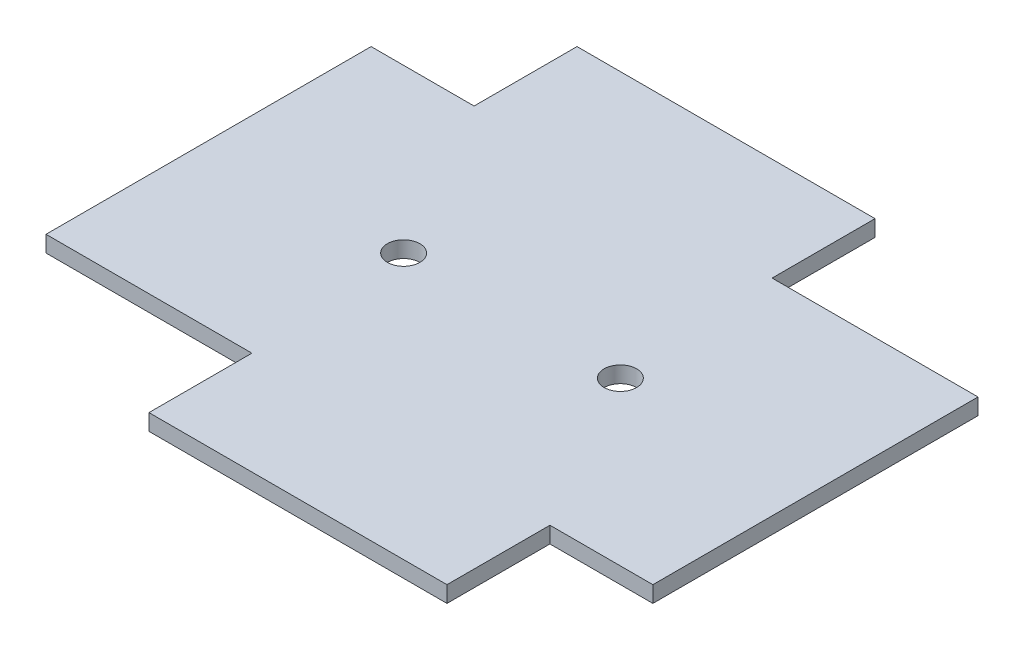
ISO-10303-21;
HEADER;
FILE_DESCRIPTION(('STEP AP214'),'2;1');
FILE_NAME('part.step','',(''),(''),'','','');
FILE_SCHEMA(('AUTOMOTIVE_DESIGN { 1 0 10303 214 1 1 1 1 }'));
ENDSEC;
DATA;
#1=APPLICATION_CONTEXT('core data for automotive mechanical design processes');
#2=APPLICATION_PROTOCOL_DEFINITION('international standard','automotive_design',2000,#1);
#3=PRODUCT_CONTEXT('',#1,'mechanical');
#4=PRODUCT('Part','Part','',(#3));
#5=PRODUCT_RELATED_PRODUCT_CATEGORY('part','',(#4));
#6=PRODUCT_DEFINITION_FORMATION('','',#4);
#7=PRODUCT_DEFINITION_CONTEXT('part definition',#1,'design');
#8=PRODUCT_DEFINITION('design','',#6,#7);
#9=PRODUCT_DEFINITION_SHAPE('','',#8);
#10=(LENGTH_UNIT() NAMED_UNIT(*) SI_UNIT(.MILLI.,.METRE.));
#11=(NAMED_UNIT(*) PLANE_ANGLE_UNIT() SI_UNIT($,.RADIAN.));
#12=(NAMED_UNIT(*) SI_UNIT($,.STERADIAN.) SOLID_ANGLE_UNIT());
#13=UNCERTAINTY_MEASURE_WITH_UNIT(LENGTH_MEASURE(1.E-05),#10,'distance_accuracy_value','');
#14=(GEOMETRIC_REPRESENTATION_CONTEXT(3) GLOBAL_UNCERTAINTY_ASSIGNED_CONTEXT((#13)) GLOBAL_UNIT_ASSIGNED_CONTEXT((#10,
#11,#12)) REPRESENTATION_CONTEXT('',''));
#15=CARTESIAN_POINT('',(0.,0.,0.));
#16=DIRECTION('',(0.,0.,1.));
#17=DIRECTION('',(1.,0.,0.));
#18=AXIS2_PLACEMENT_3D('',#15,#16,#17);
#19=CARTESIAN_POINT('',(0.,1.5,0.));
#20=DIRECTION('',(0.,1.,0.));
#21=DIRECTION('',(0.,0.,1.));
#22=AXIS2_PLACEMENT_3D('',#19,#20,#21);
#23=PLANE('',#22);
#24=CARTESIAN_POINT('',(-10.,1.5,0.));
#25=DIRECTION('',(0.,1.,0.));
#26=DIRECTION('',(0.,0.,1.));
#27=AXIS2_PLACEMENT_3D('',#24,#25,#26);
#28=CIRCLE('',#27,1.5);
#29=CARTESIAN_POINT('',(-10.,1.5,1.5));
#30=VERTEX_POINT('',#29);
#31=EDGE_CURVE('E158',#30,#30,#28,.T.);
#32=ORIENTED_EDGE('',*,*,#31,.F.);
#33=EDGE_LOOP('',(#32));
#34=FACE_BOUND('',#33,.T.);
#35=DIRECTION('',(-1.,0.,0.));
#36=VECTOR('',#35,1.);
#37=CARTESIAN_POINT('',(-18.5,1.5,-15.));
#38=LINE('',#37,#36);
#39=CARTESIAN_POINT('',(-18.5,1.5,-15.));
#40=VERTEX_POINT('',#39);
#41=CARTESIAN_POINT('',(-28.,1.5,-15.));
#42=VERTEX_POINT('',#41);
#43=EDGE_CURVE('E177',#40,#42,#38,.T.);
#44=ORIENTED_EDGE('',*,*,#43,.T.);
#45=DIRECTION('',(0.,0.,1.));
#46=VECTOR('',#45,1.);
#47=CARTESIAN_POINT('',(-28.,1.5,-15.));
#48=LINE('',#47,#46);
#49=CARTESIAN_POINT('',(-28.,1.5,15.));
#50=VERTEX_POINT('',#49);
#51=EDGE_CURVE('E105',#42,#50,#48,.T.);
#52=ORIENTED_EDGE('',*,*,#51,.T.);
#53=DIRECTION('',(1.,0.,0.));
#54=VECTOR('',#53,1.);
#55=CARTESIAN_POINT('',(-28.,1.5,15.));
#56=LINE('',#55,#54);
#57=CARTESIAN_POINT('',(-9.00000000000001,1.5,15.));
#58=VERTEX_POINT('',#57);
#59=EDGE_CURVE('E204',#50,#58,#56,.T.);
#60=ORIENTED_EDGE('',*,*,#59,.T.);
#61=DIRECTION('',(0.,0.,1.));
#62=VECTOR('',#61,1.);
#63=CARTESIAN_POINT('',(-9.00000000000001,1.5,15.));
#64=LINE('',#63,#62);
#65=CARTESIAN_POINT('',(-8.99999999999999,1.5,24.5));
#66=VERTEX_POINT('',#65);
#67=EDGE_CURVE('E223',#58,#66,#64,.T.);
#68=ORIENTED_EDGE('',*,*,#67,.T.);
#69=DIRECTION('',(1.,0.,0.));
#70=VECTOR('',#69,1.);
#71=CARTESIAN_POINT('',(-8.99999999999999,1.5,24.5));
#72=LINE('',#71,#70);
#73=CARTESIAN_POINT('',(18.5,1.5,24.5));
#74=VERTEX_POINT('',#73);
#75=EDGE_CURVE('E220',#66,#74,#72,.T.);
#76=ORIENTED_EDGE('',*,*,#75,.T.);
#77=DIRECTION('',(0.,0.,-1.));
#78=VECTOR('',#77,1.);
#79=CARTESIAN_POINT('',(18.5,1.5,24.5));
#80=LINE('',#79,#78);
#81=CARTESIAN_POINT('',(18.5,1.5,15.));
#82=VERTEX_POINT('',#81);
#83=EDGE_CURVE('E222',#74,#82,#80,.T.);
#84=ORIENTED_EDGE('',*,*,#83,.T.);
#85=DIRECTION('',(1.,0.,0.));
#86=VECTOR('',#85,1.);
#87=CARTESIAN_POINT('',(18.5,1.5,15.));
#88=LINE('',#87,#86);
#89=CARTESIAN_POINT('',(28.,1.5,15.));
#90=VERTEX_POINT('',#89);
#91=EDGE_CURVE('E225',#82,#90,#88,.T.);
#92=ORIENTED_EDGE('',*,*,#91,.T.);
#93=DIRECTION('',(0.,0.,-1.));
#94=VECTOR('',#93,1.);
#95=CARTESIAN_POINT('',(28.,1.5,15.));
#96=LINE('',#95,#94);
#97=CARTESIAN_POINT('',(28.,1.5,-15.));
#98=VERTEX_POINT('',#97);
#99=EDGE_CURVE('E231',#90,#98,#96,.T.);
#100=ORIENTED_EDGE('',*,*,#99,.T.);
#101=DIRECTION('',(-1.,0.,0.));
#102=VECTOR('',#101,1.);
#103=CARTESIAN_POINT('',(28.,1.5,-15.));
#104=LINE('',#103,#102);
#105=CARTESIAN_POINT('',(9.,1.5,-15.));
#106=VERTEX_POINT('',#105);
#107=EDGE_CURVE('E136',#98,#106,#104,.T.);
#108=ORIENTED_EDGE('',*,*,#107,.T.);
#109=DIRECTION('',(0.,0.,-1.));
#110=VECTOR('',#109,1.);
#111=CARTESIAN_POINT('',(9.,1.5,-15.));
#112=LINE('',#111,#110);
#113=CARTESIAN_POINT('',(8.99999999999999,1.5,-24.5));
#114=VERTEX_POINT('',#113);
#115=EDGE_CURVE('E130',#106,#114,#112,.T.);
#116=ORIENTED_EDGE('',*,*,#115,.T.);
#117=DIRECTION('',(-1.,0.,0.));
#118=VECTOR('',#117,1.);
#119=CARTESIAN_POINT('',(8.99999999999999,1.5,-24.5));
#120=LINE('',#119,#118);
#121=CARTESIAN_POINT('',(-18.5,1.5,-24.5));
#122=VERTEX_POINT('',#121);
#123=EDGE_CURVE('E134',#114,#122,#120,.T.);
#124=ORIENTED_EDGE('',*,*,#123,.T.);
#125=DIRECTION('',(0.,0.,1.));
#126=VECTOR('',#125,1.);
#127=CARTESIAN_POINT('',(-18.5,1.5,-24.5));
#128=LINE('',#127,#126);
#129=EDGE_CURVE('E50',#122,#40,#128,.T.);
#130=ORIENTED_EDGE('',*,*,#129,.T.);
#131=EDGE_LOOP('',(#44,#52,#60,#68,#76,#84,#92,#100,#108,#116,#124,#130));
#132=FACE_BOUND('',#131,.T.);
#133=CARTESIAN_POINT('',(10.,1.5,0.));
#134=DIRECTION('',(0.,1.,0.));
#135=DIRECTION('',(0.,0.,1.));
#136=AXIS2_PLACEMENT_3D('',#133,#134,#135);
#137=CIRCLE('',#136,1.5);
#138=CARTESIAN_POINT('',(10.,1.5,1.5));
#139=VERTEX_POINT('',#138);
#140=EDGE_CURVE('E273',#139,#139,#137,.T.);
#141=ORIENTED_EDGE('',*,*,#140,.F.);
#142=EDGE_LOOP('',(#141));
#143=FACE_BOUND('',#142,.T.);
#144=ADVANCED_FACE('F33',(#34,#132,#143),#23,.T.);
#145=CARTESIAN_POINT('',(0.,0.,0.));
#146=DIRECTION('',(0.,1.,0.));
#147=DIRECTION('',(0.,0.,1.));
#148=AXIS2_PLACEMENT_3D('',#145,#146,#147);
#149=PLANE('',#148);
#150=DIRECTION('',(-1.,0.,0.));
#151=VECTOR('',#150,1.);
#152=CARTESIAN_POINT('',(-18.5,0.,-15.));
#153=LINE('',#152,#151);
#154=CARTESIAN_POINT('',(-18.5,0.,-15.));
#155=VERTEX_POINT('',#154);
#156=CARTESIAN_POINT('',(-28.,0.,-15.));
#157=VERTEX_POINT('',#156);
#158=EDGE_CURVE('E154',#155,#157,#153,.T.);
#159=ORIENTED_EDGE('',*,*,#158,.F.);
#160=DIRECTION('',(0.,0.,1.));
#161=VECTOR('',#160,1.);
#162=CARTESIAN_POINT('',(-18.5,0.,-24.5));
#163=LINE('',#162,#161);
#164=CARTESIAN_POINT('',(-18.5,0.,-24.5));
#165=VERTEX_POINT('',#164);
#166=EDGE_CURVE('E97',#165,#155,#163,.T.);
#167=ORIENTED_EDGE('',*,*,#166,.F.);
#168=DIRECTION('',(-1.,0.,0.));
#169=VECTOR('',#168,1.);
#170=CARTESIAN_POINT('',(8.99999999999999,0.,-24.5));
#171=LINE('',#170,#169);
#172=CARTESIAN_POINT('',(8.99999999999999,0.,-24.5));
#173=VERTEX_POINT('',#172);
#174=EDGE_CURVE('E91',#173,#165,#171,.T.);
#175=ORIENTED_EDGE('',*,*,#174,.F.);
#176=DIRECTION('',(0.,0.,-1.));
#177=VECTOR('',#176,1.);
#178=CARTESIAN_POINT('',(9.,0.,-15.));
#179=LINE('',#178,#177);
#180=CARTESIAN_POINT('',(9.,0.,-15.));
#181=VERTEX_POINT('',#180);
#182=EDGE_CURVE('E144',#181,#173,#179,.T.);
#183=ORIENTED_EDGE('',*,*,#182,.F.);
#184=DIRECTION('',(-1.,0.,0.));
#185=VECTOR('',#184,1.);
#186=CARTESIAN_POINT('',(28.,0.,-15.));
#187=LINE('',#186,#185);
#188=CARTESIAN_POINT('',(28.,0.,-15.));
#189=VERTEX_POINT('',#188);
#190=EDGE_CURVE('E172',#189,#181,#187,.T.);
#191=ORIENTED_EDGE('',*,*,#190,.F.);
#192=DIRECTION('',(0.,0.,-1.));
#193=VECTOR('',#192,1.);
#194=CARTESIAN_POINT('',(28.,0.,15.));
#195=LINE('',#194,#193);
#196=CARTESIAN_POINT('',(28.,0.,15.));
#197=VERTEX_POINT('',#196);
#198=EDGE_CURVE('E170',#197,#189,#195,.T.);
#199=ORIENTED_EDGE('',*,*,#198,.F.);
#200=DIRECTION('',(1.,0.,0.));
#201=VECTOR('',#200,1.);
#202=CARTESIAN_POINT('',(18.5,0.,15.));
#203=LINE('',#202,#201);
#204=CARTESIAN_POINT('',(18.5,0.,15.));
#205=VERTEX_POINT('',#204);
#206=EDGE_CURVE('E168',#205,#197,#203,.T.);
#207=ORIENTED_EDGE('',*,*,#206,.F.);
#208=DIRECTION('',(0.,0.,-1.));
#209=VECTOR('',#208,1.);
#210=CARTESIAN_POINT('',(18.5,0.,24.5));
#211=LINE('',#210,#209);
#212=CARTESIAN_POINT('',(18.5,0.,24.5));
#213=VERTEX_POINT('',#212);
#214=EDGE_CURVE('E166',#213,#205,#211,.T.);
#215=ORIENTED_EDGE('',*,*,#214,.F.);
#216=DIRECTION('',(1.,0.,0.));
#217=VECTOR('',#216,1.);
#218=CARTESIAN_POINT('',(-8.99999999999999,0.,24.5));
#219=LINE('',#218,#217);
#220=CARTESIAN_POINT('',(-8.99999999999999,0.,24.5));
#221=VERTEX_POINT('',#220);
#222=EDGE_CURVE('E164',#221,#213,#219,.T.);
#223=ORIENTED_EDGE('',*,*,#222,.F.);
#224=DIRECTION('',(0.,0.,1.));
#225=VECTOR('',#224,1.);
#226=CARTESIAN_POINT('',(-9.00000000000001,0.,15.));
#227=LINE('',#226,#225);
#228=CARTESIAN_POINT('',(-9.00000000000001,0.,15.));
#229=VERTEX_POINT('',#228);
#230=EDGE_CURVE('E162',#229,#221,#227,.T.);
#231=ORIENTED_EDGE('',*,*,#230,.F.);
#232=DIRECTION('',(1.,0.,0.));
#233=VECTOR('',#232,1.);
#234=CARTESIAN_POINT('',(-28.,0.,15.));
#235=LINE('',#234,#233);
#236=CARTESIAN_POINT('',(-28.,0.,15.));
#237=VERTEX_POINT('',#236);
#238=EDGE_CURVE('E160',#237,#229,#235,.T.);
#239=ORIENTED_EDGE('',*,*,#238,.F.);
#240=DIRECTION('',(0.,0.,1.));
#241=VECTOR('',#240,1.);
#242=CARTESIAN_POINT('',(-28.,0.,-15.));
#243=LINE('',#242,#241);
#244=EDGE_CURVE('E157',#157,#237,#243,.T.);
#245=ORIENTED_EDGE('',*,*,#244,.F.);
#246=EDGE_LOOP('',(#159,#167,#175,#183,#191,#199,#207,#215,#223,#231,#239,#245));
#247=FACE_BOUND('',#246,.T.);
#248=CARTESIAN_POINT('',(-10.,0.,0.));
#249=DIRECTION('',(0.,1.,0.));
#250=DIRECTION('',(0.,0.,1.));
#251=AXIS2_PLACEMENT_3D('',#248,#249,#250);
#252=CIRCLE('',#251,1.5);
#253=CARTESIAN_POINT('',(-10.,0.,1.5));
#254=VERTEX_POINT('',#253);
#255=EDGE_CURVE('E279',#254,#254,#252,.T.);
#256=ORIENTED_EDGE('',*,*,#255,.T.);
#257=EDGE_LOOP('',(#256));
#258=FACE_BOUND('',#257,.T.);
#259=CARTESIAN_POINT('',(10.,0.,0.));
#260=DIRECTION('',(0.,1.,0.));
#261=DIRECTION('',(0.,0.,1.));
#262=AXIS2_PLACEMENT_3D('',#259,#260,#261);
#263=CIRCLE('',#262,1.5);
#264=CARTESIAN_POINT('',(10.,0.,1.5));
#265=VERTEX_POINT('',#264);
#266=EDGE_CURVE('E276',#265,#265,#263,.T.);
#267=ORIENTED_EDGE('',*,*,#266,.T.);
#268=EDGE_LOOP('',(#267));
#269=FACE_BOUND('',#268,.T.);
#270=ADVANCED_FACE('F208',(#247,#258,#269),#149,.F.);
#271=CARTESIAN_POINT('',(-18.5,1.5,-15.));
#272=DIRECTION('',(0.,0.,1.));
#273=DIRECTION('',(1.,0.,0.));
#274=AXIS2_PLACEMENT_3D('',#271,#272,#273);
#275=PLANE('',#274);
#276=ORIENTED_EDGE('',*,*,#158,.T.);
#277=DIRECTION('',(0.,-1.,0.));
#278=VECTOR('',#277,1.);
#279=CARTESIAN_POINT('',(-28.,1.5,-15.));
#280=LINE('',#279,#278);
#281=EDGE_CURVE('E11',#42,#157,#280,.T.);
#282=ORIENTED_EDGE('',*,*,#281,.F.);
#283=ORIENTED_EDGE('',*,*,#43,.F.);
#284=DIRECTION('',(0.,-1.,0.));
#285=VECTOR('',#284,1.);
#286=CARTESIAN_POINT('',(-18.5,1.5,-15.));
#287=LINE('',#286,#285);
#288=EDGE_CURVE('E150',#40,#155,#287,.T.);
#289=ORIENTED_EDGE('',*,*,#288,.T.);
#290=EDGE_LOOP('',(#276,#282,#283,#289));
#291=FACE_BOUND('',#290,.T.);
#292=ADVANCED_FACE('F35',(#291),#275,.F.);
#293=CARTESIAN_POINT('',(-28.,1.5,-15.));
#294=DIRECTION('',(1.,0.,0.));
#295=DIRECTION('',(0.,0.,-1.));
#296=AXIS2_PLACEMENT_3D('',#293,#294,#295);
#297=PLANE('',#296);
#298=ORIENTED_EDGE('',*,*,#244,.T.);
#299=DIRECTION('',(0.,-1.,0.));
#300=VECTOR('',#299,1.);
#301=CARTESIAN_POINT('',(-28.,1.5,15.));
#302=LINE('',#301,#300);
#303=EDGE_CURVE('E42',#50,#237,#302,.T.);
#304=ORIENTED_EDGE('',*,*,#303,.F.);
#305=ORIENTED_EDGE('',*,*,#51,.F.);
#306=ORIENTED_EDGE('',*,*,#281,.T.);
#307=EDGE_LOOP('',(#298,#304,#305,#306));
#308=FACE_BOUND('',#307,.T.);
#309=ADVANCED_FACE('F372',(#308),#297,.F.);
#310=CARTESIAN_POINT('',(-28.,1.5,15.));
#311=DIRECTION('',(0.,0.,-1.));
#312=DIRECTION('',(-1.,0.,0.));
#313=AXIS2_PLACEMENT_3D('',#310,#311,#312);
#314=PLANE('',#313);
#315=ORIENTED_EDGE('',*,*,#238,.T.);
#316=DIRECTION('',(0.,-1.,0.));
#317=VECTOR('',#316,1.);
#318=CARTESIAN_POINT('',(-9.00000000000001,1.5,15.));
#319=LINE('',#318,#317);
#320=EDGE_CURVE('E196',#58,#229,#319,.T.);
#321=ORIENTED_EDGE('',*,*,#320,.F.);
#322=ORIENTED_EDGE('',*,*,#59,.F.);
#323=ORIENTED_EDGE('',*,*,#303,.T.);
#324=EDGE_LOOP('',(#315,#321,#322,#323));
#325=FACE_BOUND('',#324,.T.);
#326=ADVANCED_FACE('F202',(#325),#314,.F.);
#327=CARTESIAN_POINT('',(-9.00000000000001,1.5,15.));
#328=DIRECTION('',(1.,0.,0.));
#329=DIRECTION('',(0.,0.,-1.));
#330=AXIS2_PLACEMENT_3D('',#327,#328,#329);
#331=PLANE('',#330);
#332=ORIENTED_EDGE('',*,*,#230,.T.);
#333=DIRECTION('',(0.,-1.,0.));
#334=VECTOR('',#333,1.);
#335=CARTESIAN_POINT('',(-8.99999999999999,1.5,24.5));
#336=LINE('',#335,#334);
#337=EDGE_CURVE('E193',#66,#221,#336,.T.);
#338=ORIENTED_EDGE('',*,*,#337,.F.);
#339=ORIENTED_EDGE('',*,*,#67,.F.);
#340=ORIENTED_EDGE('',*,*,#320,.T.);
#341=EDGE_LOOP('',(#332,#338,#339,#340));
#342=FACE_BOUND('',#341,.T.);
#343=ADVANCED_FACE('F214',(#342),#331,.F.);
#344=CARTESIAN_POINT('',(-8.99999999999999,1.5,24.5));
#345=DIRECTION('',(0.,0.,-1.));
#346=DIRECTION('',(-1.,0.,0.));
#347=AXIS2_PLACEMENT_3D('',#344,#345,#346);
#348=PLANE('',#347);
#349=ORIENTED_EDGE('',*,*,#222,.T.);
#350=DIRECTION('',(0.,-1.,0.));
#351=VECTOR('',#350,1.);
#352=CARTESIAN_POINT('',(18.5,1.5,24.5));
#353=LINE('',#352,#351);
#354=EDGE_CURVE('E190',#74,#213,#353,.T.);
#355=ORIENTED_EDGE('',*,*,#354,.F.);
#356=ORIENTED_EDGE('',*,*,#75,.F.);
#357=ORIENTED_EDGE('',*,*,#337,.T.);
#358=EDGE_LOOP('',(#349,#355,#356,#357));
#359=FACE_BOUND('',#358,.T.);
#360=ADVANCED_FACE('F218',(#359),#348,.F.);
#361=CARTESIAN_POINT('',(18.5,1.5,24.5));
#362=DIRECTION('',(-1.,0.,0.));
#363=DIRECTION('',(0.,0.,1.));
#364=AXIS2_PLACEMENT_3D('',#361,#362,#363);
#365=PLANE('',#364);
#366=ORIENTED_EDGE('',*,*,#214,.T.);
#367=DIRECTION('',(0.,-1.,0.));
#368=VECTOR('',#367,1.);
#369=CARTESIAN_POINT('',(18.5,1.5,15.));
#370=LINE('',#369,#368);
#371=EDGE_CURVE('E187',#82,#205,#370,.T.);
#372=ORIENTED_EDGE('',*,*,#371,.F.);
#373=ORIENTED_EDGE('',*,*,#83,.F.);
#374=ORIENTED_EDGE('',*,*,#354,.T.);
#375=EDGE_LOOP('',(#366,#372,#373,#374));
#376=FACE_BOUND('',#375,.T.);
#377=ADVANCED_FACE('F337',(#376),#365,.F.);
#378=CARTESIAN_POINT('',(18.5,1.5,15.));
#379=DIRECTION('',(0.,0.,-1.));
#380=DIRECTION('',(-1.,0.,0.));
#381=AXIS2_PLACEMENT_3D('',#378,#379,#380);
#382=PLANE('',#381);
#383=ORIENTED_EDGE('',*,*,#206,.T.);
#384=DIRECTION('',(0.,-1.,0.));
#385=VECTOR('',#384,1.);
#386=CARTESIAN_POINT('',(28.,1.5,15.));
#387=LINE('',#386,#385);
#388=EDGE_CURVE('E184',#90,#197,#387,.T.);
#389=ORIENTED_EDGE('',*,*,#388,.F.);
#390=ORIENTED_EDGE('',*,*,#91,.F.);
#391=ORIENTED_EDGE('',*,*,#371,.T.);
#392=EDGE_LOOP('',(#383,#389,#390,#391));
#393=FACE_BOUND('',#392,.T.);
#394=ADVANCED_FACE('F328',(#393),#382,.F.);
#395=CARTESIAN_POINT('',(28.,1.5,15.));
#396=DIRECTION('',(-1.,0.,0.));
#397=DIRECTION('',(0.,0.,1.));
#398=AXIS2_PLACEMENT_3D('',#395,#396,#397);
#399=PLANE('',#398);
#400=ORIENTED_EDGE('',*,*,#198,.T.);
#401=DIRECTION('',(0.,-1.,0.));
#402=VECTOR('',#401,1.);
#403=CARTESIAN_POINT('',(28.,1.5,-15.));
#404=LINE('',#403,#402);
#405=EDGE_CURVE('E181',#98,#189,#404,.T.);
#406=ORIENTED_EDGE('',*,*,#405,.F.);
#407=ORIENTED_EDGE('',*,*,#99,.F.);
#408=ORIENTED_EDGE('',*,*,#388,.T.);
#409=EDGE_LOOP('',(#400,#406,#407,#408));
#410=FACE_BOUND('',#409,.T.);
#411=ADVANCED_FACE('F237',(#410),#399,.F.);
#412=CARTESIAN_POINT('',(28.,1.5,-15.));
#413=DIRECTION('',(0.,0.,1.));
#414=DIRECTION('',(1.,0.,0.));
#415=AXIS2_PLACEMENT_3D('',#412,#413,#414);
#416=PLANE('',#415);
#417=ORIENTED_EDGE('',*,*,#190,.T.);
#418=DIRECTION('',(0.,-1.,0.));
#419=VECTOR('',#418,1.);
#420=CARTESIAN_POINT('',(9.,1.5,-15.));
#421=LINE('',#420,#419);
#422=EDGE_CURVE('E145',#106,#181,#421,.T.);
#423=ORIENTED_EDGE('',*,*,#422,.F.);
#424=ORIENTED_EDGE('',*,*,#107,.F.);
#425=ORIENTED_EDGE('',*,*,#405,.T.);
#426=EDGE_LOOP('',(#417,#423,#424,#425));
#427=FACE_BOUND('',#426,.T.);
#428=ADVANCED_FACE('F241',(#427),#416,.F.);
#429=CARTESIAN_POINT('',(9.,1.5,-15.));
#430=DIRECTION('',(-1.,0.,0.));
#431=DIRECTION('',(0.,0.,1.));
#432=AXIS2_PLACEMENT_3D('',#429,#430,#431);
#433=PLANE('',#432);
#434=ORIENTED_EDGE('',*,*,#182,.T.);
#435=DIRECTION('',(0.,-1.,0.));
#436=VECTOR('',#435,1.);
#437=CARTESIAN_POINT('',(8.99999999999999,1.5,-24.5));
#438=LINE('',#437,#436);
#439=EDGE_CURVE('E141',#114,#173,#438,.T.);
#440=ORIENTED_EDGE('',*,*,#439,.F.);
#441=ORIENTED_EDGE('',*,*,#115,.F.);
#442=ORIENTED_EDGE('',*,*,#422,.T.);
#443=EDGE_LOOP('',(#434,#440,#441,#442));
#444=FACE_BOUND('',#443,.T.);
#445=ADVANCED_FACE('F142',(#444),#433,.F.);
#446=CARTESIAN_POINT('',(8.99999999999999,1.5,-24.5));
#447=DIRECTION('',(0.,0.,1.));
#448=DIRECTION('',(1.,0.,0.));
#449=AXIS2_PLACEMENT_3D('',#446,#447,#448);
#450=PLANE('',#449);
#451=ORIENTED_EDGE('',*,*,#174,.T.);
#452=DIRECTION('',(0.,-1.,0.));
#453=VECTOR('',#452,1.);
#454=CARTESIAN_POINT('',(-18.5,1.5,-24.5));
#455=LINE('',#454,#453);
#456=EDGE_CURVE('E146',#122,#165,#455,.T.);
#457=ORIENTED_EDGE('',*,*,#456,.F.);
#458=ORIENTED_EDGE('',*,*,#123,.F.);
#459=ORIENTED_EDGE('',*,*,#439,.T.);
#460=EDGE_LOOP('',(#451,#457,#458,#459));
#461=FACE_BOUND('',#460,.T.);
#462=ADVANCED_FACE('F148',(#461),#450,.F.);
#463=CARTESIAN_POINT('',(-18.5,1.5,-24.5));
#464=DIRECTION('',(1.,0.,0.));
#465=DIRECTION('',(0.,0.,-1.));
#466=AXIS2_PLACEMENT_3D('',#463,#464,#465);
#467=PLANE('',#466);
#468=ORIENTED_EDGE('',*,*,#166,.T.);
#469=ORIENTED_EDGE('',*,*,#288,.F.);
#470=ORIENTED_EDGE('',*,*,#129,.F.);
#471=ORIENTED_EDGE('',*,*,#456,.T.);
#472=EDGE_LOOP('',(#468,#469,#470,#471));
#473=FACE_BOUND('',#472,.T.);
#474=ADVANCED_FACE('F245',(#473),#467,.F.);
#475=CARTESIAN_POINT('',(-10.,1.5,0.));
#476=DIRECTION('',(0.,-1.,0.));
#477=DIRECTION('',(0.,0.,-1.));
#478=AXIS2_PLACEMENT_3D('',#475,#476,#477);
#479=CYLINDRICAL_SURFACE('',#478,1.5);
#480=ORIENTED_EDGE('',*,*,#31,.T.);
#481=EDGE_LOOP('',(#480));
#482=FACE_BOUND('',#481,.T.);
#483=ORIENTED_EDGE('',*,*,#255,.F.);
#484=EDGE_LOOP('',(#483));
#485=FACE_BOUND('',#484,.T.);
#486=ADVANCED_FACE('F247',(#482,#485),#479,.F.);
#487=CARTESIAN_POINT('',(10.,1.5,0.));
#488=DIRECTION('',(0.,-1.,0.));
#489=DIRECTION('',(0.,0.,-1.));
#490=AXIS2_PLACEMENT_3D('',#487,#488,#489);
#491=CYLINDRICAL_SURFACE('',#490,1.5);
#492=ORIENTED_EDGE('',*,*,#140,.T.);
#493=EDGE_LOOP('',(#492));
#494=FACE_BOUND('',#493,.T.);
#495=ORIENTED_EDGE('',*,*,#266,.F.);
#496=EDGE_LOOP('',(#495));
#497=FACE_BOUND('',#496,.T.);
#498=ADVANCED_FACE('F253',(#494,#497),#491,.F.);
#499=CLOSED_SHELL('',(#144,#270,#292,#309,#326,#343,#360,#377,#394,#411,#428,#445,#462,#474,
#486,#498));
#500=MANIFOLD_SOLID_BREP('B2',#499);
#501=ADVANCED_BREP_SHAPE_REPRESENTATION('',(#18,#500),#14);
#502=SHAPE_DEFINITION_REPRESENTATION(#9,#501);
ENDSEC;
END-ISO-10303-21;
